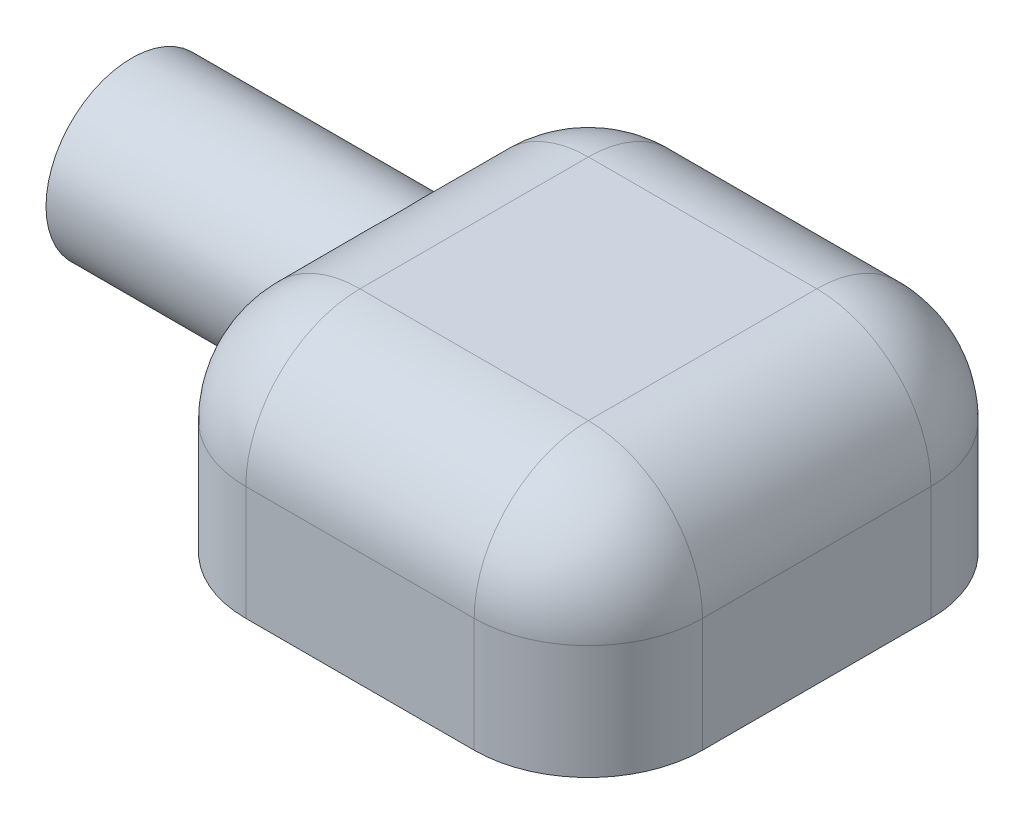
ISO-10303-21;
HEADER;
FILE_DESCRIPTION(('STEP AP214'),'2;1');
FILE_NAME('part.step','',(''),(''),'','','');
FILE_SCHEMA(('AUTOMOTIVE_DESIGN { 1 0 10303 214 1 1 1 1 }'));
ENDSEC;
DATA;
#1=APPLICATION_CONTEXT('core data for automotive mechanical design processes');
#2=APPLICATION_PROTOCOL_DEFINITION('international standard','automotive_design',2000,#1);
#3=PRODUCT_CONTEXT('',#1,'mechanical');
#4=PRODUCT('Part','Part','',(#3));
#5=PRODUCT_RELATED_PRODUCT_CATEGORY('part','',(#4));
#6=PRODUCT_DEFINITION_FORMATION('','',#4);
#7=PRODUCT_DEFINITION_CONTEXT('part definition',#1,'design');
#8=PRODUCT_DEFINITION('design','',#6,#7);
#9=PRODUCT_DEFINITION_SHAPE('','',#8);
#10=(LENGTH_UNIT() NAMED_UNIT(*) SI_UNIT(.MILLI.,.METRE.));
#11=(NAMED_UNIT(*) PLANE_ANGLE_UNIT() SI_UNIT($,.RADIAN.));
#12=(NAMED_UNIT(*) SI_UNIT($,.STERADIAN.) SOLID_ANGLE_UNIT());
#13=UNCERTAINTY_MEASURE_WITH_UNIT(LENGTH_MEASURE(1.E-05),#10,'distance_accuracy_value','');
#14=(GEOMETRIC_REPRESENTATION_CONTEXT(3) GLOBAL_UNCERTAINTY_ASSIGNED_CONTEXT((#13)) GLOBAL_UNIT_ASSIGNED_CONTEXT((#10,
#11,#12)) REPRESENTATION_CONTEXT('',''));
#15=CARTESIAN_POINT('',(0.,0.,0.));
#16=DIRECTION('',(0.,0.,1.));
#17=DIRECTION('',(1.,0.,0.));
#18=AXIS2_PLACEMENT_3D('',#15,#16,#17);
#19=CARTESIAN_POINT('',(-20.,20.,20.));
#20=DIRECTION('',(1.,0.,0.));
#21=DIRECTION('',(0.,0.,-1.));
#22=AXIS2_PLACEMENT_3D('',#19,#20,#21);
#23=PLANE('',#22);
#24=CARTESIAN_POINT('',(-20.,10.,0.));
#25=DIRECTION('',(-1.,0.,0.));
#26=DIRECTION('',(0.,0.,1.));
#27=AXIS2_PLACEMENT_3D('',#24,#25,#26);
#28=CIRCLE('',#27,7.5);
#29=CARTESIAN_POINT('',(-20.,10.,-7.5));
#30=VERTEX_POINT('',#29);
#31=CARTESIAN_POINT('',(-20.,10.,7.5));
#32=VERTEX_POINT('',#31);
#33=EDGE_CURVE('E163',#30,#32,#28,.T.);
#34=ORIENTED_EDGE('',*,*,#33,.F.);
#35=DIRECTION('',(0.,0.,1.));
#36=VECTOR('',#35,1.);
#37=CARTESIAN_POINT('',(-20.,10.,-20.));
#38=LINE('',#37,#36);
#39=CARTESIAN_POINT('',(-20.,10.,-10.));
#40=VERTEX_POINT('',#39);
#41=EDGE_CURVE('E57',#30,#40,#38,.F.);
#42=ORIENTED_EDGE('',*,*,#41,.T.);
#43=DIRECTION('',(0.,-1.,0.));
#44=VECTOR('',#43,1.);
#45=CARTESIAN_POINT('',(-20.,20.,-10.));
#46=LINE('',#45,#44);
#47=CARTESIAN_POINT('',(-20.,0.,-10.));
#48=VERTEX_POINT('',#47);
#49=EDGE_CURVE('E209',#40,#48,#46,.T.);
#50=ORIENTED_EDGE('',*,*,#49,.T.);
#51=DIRECTION('',(0.,0.,1.));
#52=VECTOR('',#51,1.);
#53=CARTESIAN_POINT('',(-20.,0.,20.));
#54=LINE('',#53,#52);
#55=CARTESIAN_POINT('',(-20.,0.,10.));
#56=VERTEX_POINT('',#55);
#57=EDGE_CURVE('E308',#48,#56,#54,.T.);
#58=ORIENTED_EDGE('',*,*,#57,.T.);
#59=DIRECTION('',(0.,-1.,0.));
#60=VECTOR('',#59,1.);
#61=CARTESIAN_POINT('',(-20.,20.,10.));
#62=LINE('',#61,#60);
#63=CARTESIAN_POINT('',(-20.,10.,10.));
#64=VERTEX_POINT('',#63);
#65=EDGE_CURVE('E64',#56,#64,#62,.F.);
#66=ORIENTED_EDGE('',*,*,#65,.T.);
#67=DIRECTION('',(0.,0.,1.));
#68=VECTOR('',#67,1.);
#69=CARTESIAN_POINT('',(-20.,10.,-20.));
#70=LINE('',#69,#68);
#71=EDGE_CURVE('E206',#64,#32,#70,.F.);
#72=ORIENTED_EDGE('',*,*,#71,.T.);
#73=EDGE_LOOP('',(#34,#42,#50,#58,#66,#72));
#74=FACE_BOUND('',#73,.T.);
#75=ADVANCED_FACE('F39',(#74),#23,.F.);
#76=CARTESIAN_POINT('',(20.,20.,20.));
#77=DIRECTION('',(0.,0.,-1.));
#78=DIRECTION('',(-1.,0.,0.));
#79=AXIS2_PLACEMENT_3D('',#76,#77,#78);
#80=PLANE('',#79);
#81=DIRECTION('',(1.,0.,0.));
#82=VECTOR('',#81,1.);
#83=CARTESIAN_POINT('',(20.,0.,20.));
#84=LINE('',#83,#82);
#85=CARTESIAN_POINT('',(-9.99999999999999,0.,20.));
#86=VERTEX_POINT('',#85);
#87=CARTESIAN_POINT('',(10.,0.,20.));
#88=VERTEX_POINT('',#87);
#89=EDGE_CURVE('E302',#86,#88,#84,.T.);
#90=ORIENTED_EDGE('',*,*,#89,.T.);
#91=DIRECTION('',(0.,-1.,0.));
#92=VECTOR('',#91,1.);
#93=CARTESIAN_POINT('',(10.,20.,20.));
#94=LINE('',#93,#92);
#95=CARTESIAN_POINT('',(10.,10.,20.));
#96=VERTEX_POINT('',#95);
#97=EDGE_CURVE('E184',#88,#96,#94,.F.);
#98=ORIENTED_EDGE('',*,*,#97,.T.);
#99=DIRECTION('',(1.,0.,0.));
#100=VECTOR('',#99,1.);
#101=CARTESIAN_POINT('',(-20.,10.,20.));
#102=LINE('',#101,#100);
#103=CARTESIAN_POINT('',(-9.99999999999999,10.,20.));
#104=VERTEX_POINT('',#103);
#105=EDGE_CURVE('E180',#96,#104,#102,.F.);
#106=ORIENTED_EDGE('',*,*,#105,.T.);
#107=DIRECTION('',(0.,-1.,0.));
#108=VECTOR('',#107,1.);
#109=CARTESIAN_POINT('',(-9.99999999999999,20.,20.));
#110=LINE('',#109,#108);
#111=EDGE_CURVE('E177',#104,#86,#110,.T.);
#112=ORIENTED_EDGE('',*,*,#111,.T.);
#113=EDGE_LOOP('',(#90,#98,#106,#112));
#114=FACE_BOUND('',#113,.T.);
#115=ADVANCED_FACE('F263',(#114),#80,.F.);
#116=CARTESIAN_POINT('',(20.,20.,20.));
#117=DIRECTION('',(-1.,0.,0.));
#118=DIRECTION('',(0.,0.,1.));
#119=AXIS2_PLACEMENT_3D('',#116,#117,#118);
#120=PLANE('',#119);
#121=DIRECTION('',(0.,0.,-1.));
#122=VECTOR('',#121,1.);
#123=CARTESIAN_POINT('',(20.,0.,20.));
#124=LINE('',#123,#122);
#125=CARTESIAN_POINT('',(20.,0.,10.));
#126=VERTEX_POINT('',#125);
#127=CARTESIAN_POINT('',(20.,0.,-10.));
#128=VERTEX_POINT('',#127);
#129=EDGE_CURVE('E305',#126,#128,#124,.T.);
#130=ORIENTED_EDGE('',*,*,#129,.T.);
#131=DIRECTION('',(0.,-1.,0.));
#132=VECTOR('',#131,1.);
#133=CARTESIAN_POINT('',(20.,20.,-10.));
#134=LINE('',#133,#132);
#135=CARTESIAN_POINT('',(20.,10.,-10.));
#136=VERTEX_POINT('',#135);
#137=EDGE_CURVE('E193',#128,#136,#134,.F.);
#138=ORIENTED_EDGE('',*,*,#137,.T.);
#139=DIRECTION('',(0.,0.,-1.));
#140=VECTOR('',#139,1.);
#141=CARTESIAN_POINT('',(20.,10.,20.));
#142=LINE('',#141,#140);
#143=CARTESIAN_POINT('',(20.,10.,10.));
#144=VERTEX_POINT('',#143);
#145=EDGE_CURVE('E190',#136,#144,#142,.F.);
#146=ORIENTED_EDGE('',*,*,#145,.T.);
#147=DIRECTION('',(0.,-1.,0.));
#148=VECTOR('',#147,1.);
#149=CARTESIAN_POINT('',(20.,20.,10.));
#150=LINE('',#149,#148);
#151=EDGE_CURVE('E187',#144,#126,#150,.T.);
#152=ORIENTED_EDGE('',*,*,#151,.T.);
#153=EDGE_LOOP('',(#130,#138,#146,#152));
#154=FACE_BOUND('',#153,.T.);
#155=ADVANCED_FACE('F268',(#154),#120,.F.);
#156=CARTESIAN_POINT('',(20.,20.,-20.));
#157=DIRECTION('',(0.,0.,1.));
#158=DIRECTION('',(1.,0.,0.));
#159=AXIS2_PLACEMENT_3D('',#156,#157,#158);
#160=PLANE('',#159);
#161=DIRECTION('',(-1.,0.,0.));
#162=VECTOR('',#161,1.);
#163=CARTESIAN_POINT('',(20.,0.,-20.));
#164=LINE('',#163,#162);
#165=CARTESIAN_POINT('',(10.,0.,-20.));
#166=VERTEX_POINT('',#165);
#167=CARTESIAN_POINT('',(-9.99999999999999,0.,-20.));
#168=VERTEX_POINT('',#167);
#169=EDGE_CURVE('E167',#166,#168,#164,.T.);
#170=ORIENTED_EDGE('',*,*,#169,.T.);
#171=DIRECTION('',(0.,-1.,0.));
#172=VECTOR('',#171,1.);
#173=CARTESIAN_POINT('',(-9.99999999999999,20.,-20.));
#174=LINE('',#173,#172);
#175=CARTESIAN_POINT('',(-10.,10.,-20.));
#176=VERTEX_POINT('',#175);
#177=EDGE_CURVE('E201',#168,#176,#174,.F.);
#178=ORIENTED_EDGE('',*,*,#177,.T.);
#179=DIRECTION('',(-1.,0.,0.));
#180=VECTOR('',#179,1.);
#181=CARTESIAN_POINT('',(20.,10.,-20.));
#182=LINE('',#181,#180);
#183=CARTESIAN_POINT('',(10.,10.,-20.));
#184=VERTEX_POINT('',#183);
#185=EDGE_CURVE('E143',#176,#184,#182,.F.);
#186=ORIENTED_EDGE('',*,*,#185,.T.);
#187=DIRECTION('',(0.,-1.,0.));
#188=VECTOR('',#187,1.);
#189=CARTESIAN_POINT('',(10.,20.,-20.));
#190=LINE('',#189,#188);
#191=EDGE_CURVE('E196',#184,#166,#190,.T.);
#192=ORIENTED_EDGE('',*,*,#191,.T.);
#193=EDGE_LOOP('',(#170,#178,#186,#192));
#194=FACE_BOUND('',#193,.T.);
#195=ADVANCED_FACE('F365',(#194),#160,.F.);
#196=CARTESIAN_POINT('',(0.,20.,0.));
#197=DIRECTION('',(0.,1.,0.));
#198=DIRECTION('',(0.,0.,1.));
#199=AXIS2_PLACEMENT_3D('',#196,#197,#198);
#200=PLANE('',#199);
#201=DIRECTION('',(0.,0.,1.));
#202=VECTOR('',#201,1.);
#203=CARTESIAN_POINT('',(-10.,20.,20.));
#204=LINE('',#203,#202);
#205=CARTESIAN_POINT('',(-10.,20.,-10.));
#206=VERTEX_POINT('',#205);
#207=CARTESIAN_POINT('',(-10.,20.,10.));
#208=VERTEX_POINT('',#207);
#209=EDGE_CURVE('E129',#206,#208,#204,.T.);
#210=ORIENTED_EDGE('',*,*,#209,.T.);
#211=DIRECTION('',(1.,0.,0.));
#212=VECTOR('',#211,1.);
#213=CARTESIAN_POINT('',(20.,20.,10.));
#214=LINE('',#213,#212);
#215=CARTESIAN_POINT('',(10.,20.,10.));
#216=VERTEX_POINT('',#215);
#217=EDGE_CURVE('E174',#208,#216,#214,.T.);
#218=ORIENTED_EDGE('',*,*,#217,.T.);
#219=DIRECTION('',(0.,0.,-1.));
#220=VECTOR('',#219,1.);
#221=CARTESIAN_POINT('',(10.,20.,-20.));
#222=LINE('',#221,#220);
#223=CARTESIAN_POINT('',(10.,20.,-10.));
#224=VERTEX_POINT('',#223);
#225=EDGE_CURVE('E132',#216,#224,#222,.T.);
#226=ORIENTED_EDGE('',*,*,#225,.T.);
#227=DIRECTION('',(-1.,0.,0.));
#228=VECTOR('',#227,1.);
#229=CARTESIAN_POINT('',(-20.,20.,-10.));
#230=LINE('',#229,#228);
#231=EDGE_CURVE('E124',#224,#206,#230,.T.);
#232=ORIENTED_EDGE('',*,*,#231,.T.);
#233=EDGE_LOOP('',(#210,#218,#226,#232));
#234=FACE_BOUND('',#233,.T.);
#235=ADVANCED_FACE('F126',(#234),#200,.T.);
#236=CARTESIAN_POINT('',(0.,0.,0.));
#237=DIRECTION('',(0.,1.,0.));
#238=DIRECTION('',(0.,0.,1.));
#239=AXIS2_PLACEMENT_3D('',#236,#237,#238);
#240=PLANE('',#239);
#241=CARTESIAN_POINT('',(0.,0.,0.));
#242=DIRECTION('',(0.,-1.,0.));
#243=DIRECTION('',(0.,0.,-1.));
#244=AXIS2_PLACEMENT_3D('',#241,#242,#243);
#245=CIRCLE('',#244,5.);
#246=CARTESIAN_POINT('',(0.,0.,-5.));
#247=VERTEX_POINT('',#246);
#248=EDGE_CURVE('E315',#247,#247,#245,.T.);
#249=ORIENTED_EDGE('',*,*,#248,.F.);
#250=EDGE_LOOP('',(#249));
#251=FACE_BOUND('',#250,.T.);
#252=ORIENTED_EDGE('',*,*,#57,.F.);
#253=CARTESIAN_POINT('',(-10.,0.,-10.));
#254=DIRECTION('',(0.,1.,0.));
#255=DIRECTION('',(0.,0.,1.));
#256=AXIS2_PLACEMENT_3D('',#253,#254,#255);
#257=CIRCLE('',#256,10.);
#258=EDGE_CURVE('E49',#48,#168,#257,.F.);
#259=ORIENTED_EDGE('',*,*,#258,.T.);
#260=ORIENTED_EDGE('',*,*,#169,.F.);
#261=CARTESIAN_POINT('',(10.,0.,-10.));
#262=DIRECTION('',(0.,1.,0.));
#263=DIRECTION('',(0.,0.,1.));
#264=AXIS2_PLACEMENT_3D('',#261,#262,#263);
#265=CIRCLE('',#264,10.);
#266=EDGE_CURVE('E220',#166,#128,#265,.F.);
#267=ORIENTED_EDGE('',*,*,#266,.T.);
#268=ORIENTED_EDGE('',*,*,#129,.F.);
#269=CARTESIAN_POINT('',(10.,0.,10.));
#270=DIRECTION('',(0.,1.,0.));
#271=DIRECTION('',(0.,0.,1.));
#272=AXIS2_PLACEMENT_3D('',#269,#270,#271);
#273=CIRCLE('',#272,10.);
#274=EDGE_CURVE('E217',#126,#88,#273,.F.);
#275=ORIENTED_EDGE('',*,*,#274,.T.);
#276=ORIENTED_EDGE('',*,*,#89,.F.);
#277=CARTESIAN_POINT('',(-9.99999999999999,0.,10.));
#278=DIRECTION('',(0.,1.,0.));
#279=DIRECTION('',(0.,0.,1.));
#280=AXIS2_PLACEMENT_3D('',#277,#278,#279);
#281=CIRCLE('',#280,10.);
#282=EDGE_CURVE('E214',#86,#56,#281,.F.);
#283=ORIENTED_EDGE('',*,*,#282,.T.);
#284=EDGE_LOOP('',(#252,#259,#260,#267,#268,#275,#276,#283));
#285=FACE_BOUND('',#284,.T.);
#286=ADVANCED_FACE('F301',(#251,#285),#240,.F.);
#287=CARTESIAN_POINT('',(0.,10.,0.));
#288=DIRECTION('',(0.,-1.,0.));
#289=DIRECTION('',(0.,0.,-1.));
#290=AXIS2_PLACEMENT_3D('',#287,#288,#289);
#291=CYLINDRICAL_SURFACE('',#290,5.);
#292=CARTESIAN_POINT('',(0.,10.,0.));
#293=DIRECTION('',(0.,-1.,0.));
#294=DIRECTION('',(0.,0.,-1.));
#295=AXIS2_PLACEMENT_3D('',#292,#293,#294);
#296=CIRCLE('',#295,5.);
#297=CARTESIAN_POINT('',(0.,10.,-5.));
#298=VERTEX_POINT('',#297);
#299=EDGE_CURVE('E312',#298,#298,#296,.T.);
#300=ORIENTED_EDGE('',*,*,#299,.F.);
#301=EDGE_LOOP('',(#300));
#302=FACE_BOUND('',#301,.T.);
#303=ORIENTED_EDGE('',*,*,#248,.T.);
#304=EDGE_LOOP('',(#303));
#305=FACE_BOUND('',#304,.T.);
#306=ADVANCED_FACE('F379',(#302,#305),#291,.F.);
#307=CARTESIAN_POINT('',(0.,10.,0.));
#308=DIRECTION('',(0.,-1.,0.));
#309=DIRECTION('',(0.,0.,-1.));
#310=AXIS2_PLACEMENT_3D('',#307,#308,#309);
#311=PLANE('',#310);
#312=ORIENTED_EDGE('',*,*,#299,.T.);
#313=EDGE_LOOP('',(#312));
#314=FACE_BOUND('',#313,.T.);
#315=ADVANCED_FACE('F384',(#314),#311,.T.);
#316=CARTESIAN_POINT('',(-40.,10.,0.));
#317=DIRECTION('',(1.,0.,0.));
#318=DIRECTION('',(0.,0.,-1.));
#319=AXIS2_PLACEMENT_3D('',#316,#317,#318);
#320=CYLINDRICAL_SURFACE('',#319,7.5);
#321=CARTESIAN_POINT('',(-40.,10.,0.));
#322=DIRECTION('',(-1.,0.,0.));
#323=DIRECTION('',(0.,0.,1.));
#324=AXIS2_PLACEMENT_3D('',#321,#322,#323);
#325=CIRCLE('',#324,7.5);
#326=CARTESIAN_POINT('',(-40.,10.,7.5));
#327=VERTEX_POINT('',#326);
#328=EDGE_CURVE('E319',#327,#327,#325,.T.);
#329=ORIENTED_EDGE('',*,*,#328,.F.);
#330=EDGE_LOOP('',(#329));
#331=FACE_BOUND('',#330,.T.);
#332=ORIENTED_EDGE('',*,*,#33,.T.);
#333=CARTESIAN_POINT('',(-20.,10.,7.5));
#334=CARTESIAN_POINT('',(-20.0000431104682,10.1841738744631,7.50004050321944));
#335=CARTESIAN_POINT('',(-19.9949137933506,10.3683219259622,7.49321787631811));
#336=CARTESIAN_POINT('',(-19.9746322944943,10.7349592518763,7.46615279451846));
#337=CARTESIAN_POINT('',(-19.9594865115322,10.9174495099331,7.44591890706099));
#338=CARTESIAN_POINT('',(-19.9196285842821,11.2781787860852,7.39251824996346));
#339=CARTESIAN_POINT('',(-19.8949818446439,11.456438211211,7.35943989061012));
#340=CARTESIAN_POINT('',(-19.8366891942072,11.8087046669283,7.28087574757302));
#341=CARTESIAN_POINT('',(-19.8030422965333,11.9827112289046,7.23538860324386));
#342=CARTESIAN_POINT('',(-19.7275566853336,12.3249219518872,7.13278095988876));
#343=CARTESIAN_POINT('',(-19.6857390753953,12.4931397749925,7.07569041555169));
#344=CARTESIAN_POINT('',(-19.5946789503449,12.8233892421049,6.95051788317897));
#345=CARTESIAN_POINT('',(-19.5454334895583,12.9854183997722,6.88243153375904));
#346=CARTESIAN_POINT('',(-19.3877730974116,13.4613983089517,6.66264144761604));
#347=CARTESIAN_POINT('',(-19.2694680316575,13.7650932406762,6.49545195104048));
#348=CARTESIAN_POINT('',(-19.0024538167944,14.3674188239573,6.10864605094154));
#349=CARTESIAN_POINT('',(-18.851950616732,14.6630256757502,5.88562595031234));
#350=CARTESIAN_POINT('',(-18.5382897629343,15.2152099623529,5.40244124260132));
#351=CARTESIAN_POINT('',(-18.3751157087064,15.471735496907,5.14222811608287));
#352=CARTESIAN_POINT('',(-18.11230553927,15.8498322868317,4.69866085026372));
#353=CARTESIAN_POINT('',(-18.0132228243878,15.9844868547981,4.52592400461853));
#354=CARTESIAN_POINT('',(-17.8169225501917,16.2387082025361,4.16852839903836));
#355=CARTESIAN_POINT('',(-17.7197055612519,16.3582704287992,3.98386606634736));
#356=CARTESIAN_POINT('',(-17.530244611729,16.5815525892536,3.60302923743356));
#357=CARTESIAN_POINT('',(-17.4379957444358,16.685288347074,3.4068665148809));
#358=CARTESIAN_POINT('',(-17.2619499836615,16.8761125986537,3.00315722477742));
#359=CARTESIAN_POINT('',(-17.1781482905307,16.9632105714057,2.79561722643469));
#360=CARTESIAN_POINT('',(-16.9988600344767,17.1440083098094,2.30254773832761));
#361=CARTESIAN_POINT('',(-16.9078738284527,17.2313029582894,2.01287364916542));
#362=CARTESIAN_POINT('',(-16.7958278418222,17.3361667462076,1.56653373641359));
#363=CARTESIAN_POINT('',(-16.7625632191023,17.3667651143917,1.41587010436073));
#364=CARTESIAN_POINT('',(-16.7054111919796,17.4188246702935,1.1112497493723));
#365=CARTESIAN_POINT('',(-16.6815189556027,17.4402905667803,0.957294766593801));
#366=CARTESIAN_POINT('',(-16.6439948814974,17.4738195703279,0.645615393988582));
#367=CARTESIAN_POINT('',(-16.6304622538383,17.4857917981603,0.487869122565862));
#368=CARTESIAN_POINT('',(-16.6147101457692,17.4997148044991,0.171366694033752));
#369=CARTESIAN_POINT('',(-16.6124903549221,17.5016658579979,0.0126105647556987));
#370=CARTESIAN_POINT('',(-16.6194861928762,17.49549376108,-0.304506706637779));
#371=CARTESIAN_POINT('',(-16.6287055740905,17.4873673049191,-0.462867702058576));
#372=CARTESIAN_POINT('',(-16.6580933170681,17.4612438430627,-0.777706659833864));
#373=CARTESIAN_POINT('',(-16.6782617904185,17.4432467367709,-0.934184602980699));
#374=CARTESIAN_POINT('',(-16.7484102609705,17.3798860355031,-1.36575156826947));
#375=CARTESIAN_POINT('',(-16.8093652127514,17.3241294293293,-1.6376092681829));
#376=CARTESIAN_POINT('',(-16.9557042710842,17.1852765476938,-2.16727426939731));
#377=CARTESIAN_POINT('',(-17.0411115168492,17.1021543649567,-2.42506798553943));
#378=CARTESIAN_POINT('',(-17.2109904166375,16.9291749655751,-2.87816648865653));
#379=CARTESIAN_POINT('',(-17.2926611077226,16.843470860649,-3.07615359093676));
#380=CARTESIAN_POINT('',(-17.4634165372545,16.6568318226309,-3.46156982641272));
#381=CARTESIAN_POINT('',(-17.5525050689389,16.5558890752844,-3.64899347464078));
#382=CARTESIAN_POINT('',(-17.7351714741661,16.3393405092557,-4.01345092424072));
#383=CARTESIAN_POINT('',(-17.8287584051296,16.2237042647876,-4.19046201877399));
#384=CARTESIAN_POINT('',(-18.0176128439829,15.978447932338,-4.5334981921366));
#385=CARTESIAN_POINT('',(-18.1128800848597,15.8488300496851,-4.69952499687611));
#386=CARTESIAN_POINT('',(-18.3052079825125,15.5724834421015,-5.02434388761625));
#387=CARTESIAN_POINT('',(-18.4022534375536,15.4254061981582,-5.18284875808462));
#388=CARTESIAN_POINT('',(-18.5934779383871,15.1171321583938,-5.48743169744924));
#389=CARTESIAN_POINT('',(-18.6876566824554,14.9559338831968,-5.63350846115954));
#390=CARTESIAN_POINT('',(-18.8708645951805,14.6199906476629,-5.91212575715525));
#391=CARTESIAN_POINT('',(-18.9599015494407,14.445267158807,-6.04468700052519));
#392=CARTESIAN_POINT('',(-19.1308952209463,14.0825152156026,-6.29536679958986));
#393=CARTESIAN_POINT('',(-19.2128538512084,13.8944903812779,-6.41348926117587));
#394=CARTESIAN_POINT('',(-19.3521626385218,13.5447236904022,-6.61187399722417));
#395=CARTESIAN_POINT('',(-19.4111561854588,13.3852459895458,-6.69498345710786));
#396=CARTESIAN_POINT('',(-19.522269197005,13.0587747501575,-6.85029604213204));
#397=CARTESIAN_POINT('',(-19.5743901145844,12.8917828102863,-6.9225014730075));
#398=CARTESIAN_POINT('',(-19.6706867816775,12.5512875862025,-7.05508718709219));
#399=CARTESIAN_POINT('',(-19.7148758315408,12.3777958030351,-7.11548728118843));
#400=CARTESIAN_POINT('',(-19.7944894774144,12.0250061742528,-7.22380610298345));
#401=CARTESIAN_POINT('',(-19.8299159056274,11.845709551271,-7.27172744001361));
#402=CARTESIAN_POINT('',(-19.8833392235779,11.5291677960773,-7.34376026982323));
#403=CARTESIAN_POINT('',(-19.9034758036527,11.3929461693576,-7.3708259243877));
#404=CARTESIAN_POINT('',(-19.9382084156022,11.118540909062,-7.41742727390435));
#405=CARTESIAN_POINT('',(-19.9528056048828,10.9803576916095,-7.43696454185859));
#406=CARTESIAN_POINT('',(-19.9762945559199,10.7021900338182,-7.46837118933213));
#407=CARTESIAN_POINT('',(-19.9851679650993,10.5622012531547,-7.48021590447394));
#408=CARTESIAN_POINT('',(-19.9970292580462,10.2814777144256,-7.49603882915343));
#409=CARTESIAN_POINT('',(-20.0000148434033,10.1407426865369,-7.50001396667261));
#410=CARTESIAN_POINT('',(-20.,10.,-7.5));
#411=B_SPLINE_CURVE_WITH_KNOTS('',3,(#333,#334,#335,#336,#337,#338,#339,#340,#341,#342,#343,
#344,#345,#346,#347,#348,#349,#350,#351,#352,#353,#354,#355,#356,#357,#358,#359,#360,#361,#362,
#363,#364,#365,#366,#367,#368,#369,#370,#371,#372,#373,#374,#375,#376,#377,#378,#379,#380,#381,
#382,#383,#384,#385,#386,#387,#388,#389,#390,#391,#392,#393,#394,#395,#396,#397,#398,#399,#400,
#401,#402,#403,#404,#405,#406,#407,#408,#409,#410),.UNSPECIFIED.,.F.,.F.,(4,2,2,2,2,2,2,2,2,2,2,
2,2,2,2,2,2,2,2,2,2,2,2,2,2,2,2,2,2,2,2,2,2,2,2,2,2,2,4),(0.,0.552283190814487,1.10421390924166,
1.65241109509657,2.20066841592936,2.74752796456997,3.2946049551318,4.38922973516188,
5.58433366881164,6.78101112763898,7.50151780672138,8.22224135282451,8.94223951452471,
9.66182624246,10.6057191345898,11.0771371309276,11.548311765253,12.0239440873989,
12.4995633575875,12.9753386873247,13.4511188659961,14.3000694308117,15.1498260282635,
15.840971314364,16.5324722257575,17.2254291011417,17.9182768355854,18.6285606539084,
19.3389189736094,20.048171846518,20.7572324300522,21.3244844058571,21.8916162637056,
22.4577880715925,23.0238413966595,23.4445504418576,23.8651715352102,24.287134679748,
24.7092625120558),.UNSPECIFIED.);
#412=EDGE_CURVE('E11',#32,#30,#411,.T.);
#413=ORIENTED_EDGE('',*,*,#412,.T.);
#414=EDGE_LOOP('',(#332,#413));
#415=FACE_BOUND('',#414,.T.);
#416=ADVANCED_FACE('F233',(#331,#415),#320,.T.);
#417=CARTESIAN_POINT('',(-40.,10.,0.));
#418=DIRECTION('',(-1.,0.,0.));
#419=DIRECTION('',(0.,0.,1.));
#420=AXIS2_PLACEMENT_3D('',#417,#418,#419);
#421=PLANE('',#420);
#422=ORIENTED_EDGE('',*,*,#328,.T.);
#423=EDGE_LOOP('',(#422));
#424=FACE_BOUND('',#423,.T.);
#425=ADVANCED_FACE('F260',(#424),#421,.T.);
#426=CARTESIAN_POINT('',(-10.,20.,-10.));
#427=DIRECTION('',(0.,-1.,0.));
#428=DIRECTION('',(0.,0.,-1.));
#429=AXIS2_PLACEMENT_3D('',#426,#427,#428);
#430=CYLINDRICAL_SURFACE('',#429,10.);
#431=ORIENTED_EDGE('',*,*,#258,.F.);
#432=ORIENTED_EDGE('',*,*,#49,.F.);
#433=CARTESIAN_POINT('',(-9.99999999999999,10.,-10.));
#434=DIRECTION('',(0.,1.,0.));
#435=DIRECTION('',(0.,0.,1.));
#436=AXIS2_PLACEMENT_3D('',#433,#434,#435);
#437=CIRCLE('',#436,10.);
#438=EDGE_CURVE('E43',#176,#40,#437,.T.);
#439=ORIENTED_EDGE('',*,*,#438,.F.);
#440=ORIENTED_EDGE('',*,*,#177,.F.);
#441=EDGE_LOOP('',(#431,#432,#439,#440));
#442=FACE_BOUND('',#441,.T.);
#443=ADVANCED_FACE('F41',(#442),#430,.T.);
#444=CARTESIAN_POINT('',(0.,10.,-10.));
#445=DIRECTION('',(1.,0.,0.));
#446=DIRECTION('',(0.,0.,-1.));
#447=AXIS2_PLACEMENT_3D('',#444,#445,#446);
#448=CYLINDRICAL_SURFACE('',#447,10.);
#449=CARTESIAN_POINT('',(10.,10.,-10.));
#450=DIRECTION('',(1.,0.,0.));
#451=DIRECTION('',(0.,1.,0.));
#452=AXIS2_PLACEMENT_3D('',#449,#450,#451);
#453=CIRCLE('',#452,10.);
#454=EDGE_CURVE('E148',#184,#224,#453,.T.);
#455=ORIENTED_EDGE('',*,*,#454,.F.);
#456=ORIENTED_EDGE('',*,*,#185,.F.);
#457=CARTESIAN_POINT('',(-10.,10.,-10.));
#458=DIRECTION('',(-1.,0.,0.));
#459=DIRECTION('',(0.,0.,1.));
#460=AXIS2_PLACEMENT_3D('',#457,#458,#459);
#461=CIRCLE('',#460,10.);
#462=EDGE_CURVE('E140',#206,#176,#461,.T.);
#463=ORIENTED_EDGE('',*,*,#462,.F.);
#464=ORIENTED_EDGE('',*,*,#231,.F.);
#465=EDGE_LOOP('',(#455,#456,#463,#464));
#466=FACE_BOUND('',#465,.T.);
#467=ADVANCED_FACE('F142',(#466),#448,.T.);
#468=CARTESIAN_POINT('',(10.,20.,-10.));
#469=DIRECTION('',(0.,-1.,0.));
#470=DIRECTION('',(0.,0.,-1.));
#471=AXIS2_PLACEMENT_3D('',#468,#469,#470);
#472=CYLINDRICAL_SURFACE('',#471,10.);
#473=ORIENTED_EDGE('',*,*,#266,.F.);
#474=ORIENTED_EDGE('',*,*,#191,.F.);
#475=CARTESIAN_POINT('',(10.,10.,-10.));
#476=DIRECTION('',(0.,1.,0.));
#477=DIRECTION('',(0.,0.,1.));
#478=AXIS2_PLACEMENT_3D('',#475,#476,#477);
#479=CIRCLE('',#478,10.);
#480=EDGE_CURVE('E154',#136,#184,#479,.T.);
#481=ORIENTED_EDGE('',*,*,#480,.F.);
#482=ORIENTED_EDGE('',*,*,#137,.F.);
#483=EDGE_LOOP('',(#473,#474,#481,#482));
#484=FACE_BOUND('',#483,.T.);
#485=ADVANCED_FACE('F253',(#484),#472,.T.);
#486=CARTESIAN_POINT('',(-10.,10.,-10.));
#487=DIRECTION('',(0.,0.,1.));
#488=DIRECTION('',(1.,0.,0.));
#489=AXIS2_PLACEMENT_3D('',#486,#487,#488);
#490=SPHERICAL_SURFACE('',#489,10.);
#491=ORIENTED_EDGE('',*,*,#462,.T.);
#492=ORIENTED_EDGE('',*,*,#438,.T.);
#493=CARTESIAN_POINT('',(-10.,10.,-10.));
#494=DIRECTION('',(0.,0.,-1.));
#495=DIRECTION('',(-1.,0.,0.));
#496=AXIS2_PLACEMENT_3D('',#493,#494,#495);
#497=CIRCLE('',#496,10.);
#498=EDGE_CURVE('E150',#206,#40,#497,.F.);
#499=ORIENTED_EDGE('',*,*,#498,.F.);
#500=EDGE_LOOP('',(#491,#492,#499));
#501=FACE_BOUND('',#500,.T.);
#502=ADVANCED_FACE('F151',(#501),#490,.T.);
#503=CARTESIAN_POINT('',(10.,10.,-10.));
#504=DIRECTION('',(0.,0.,1.));
#505=DIRECTION('',(1.,0.,0.));
#506=AXIS2_PLACEMENT_3D('',#503,#504,#505);
#507=SPHERICAL_SURFACE('',#506,10.);
#508=ORIENTED_EDGE('',*,*,#480,.T.);
#509=ORIENTED_EDGE('',*,*,#454,.T.);
#510=CARTESIAN_POINT('',(10.,10.,-10.));
#511=DIRECTION('',(0.,0.,-1.));
#512=DIRECTION('',(-1.,0.,0.));
#513=AXIS2_PLACEMENT_3D('',#510,#511,#512);
#514=CIRCLE('',#513,10.);
#515=EDGE_CURVE('E155',#136,#224,#514,.F.);
#516=ORIENTED_EDGE('',*,*,#515,.F.);
#517=EDGE_LOOP('',(#508,#509,#516));
#518=FACE_BOUND('',#517,.T.);
#519=ADVANCED_FACE('F246',(#518),#507,.T.);
#520=CARTESIAN_POINT('',(-9.99999999999999,20.,10.));
#521=DIRECTION('',(0.,-1.,0.));
#522=DIRECTION('',(0.,0.,-1.));
#523=AXIS2_PLACEMENT_3D('',#520,#521,#522);
#524=CYLINDRICAL_SURFACE('',#523,10.);
#525=ORIENTED_EDGE('',*,*,#282,.F.);
#526=ORIENTED_EDGE('',*,*,#111,.F.);
#527=CARTESIAN_POINT('',(-10.,10.,10.));
#528=DIRECTION('',(0.,1.,0.));
#529=DIRECTION('',(0.,0.,1.));
#530=AXIS2_PLACEMENT_3D('',#527,#528,#529);
#531=CIRCLE('',#530,10.);
#532=EDGE_CURVE('E336',#64,#104,#531,.T.);
#533=ORIENTED_EDGE('',*,*,#532,.F.);
#534=ORIENTED_EDGE('',*,*,#65,.F.);
#535=EDGE_LOOP('',(#525,#526,#533,#534));
#536=FACE_BOUND('',#535,.T.);
#537=ADVANCED_FACE('F242',(#536),#524,.T.);
#538=CARTESIAN_POINT('',(-10.,10.,0.));
#539=DIRECTION('',(0.,0.,-1.));
#540=DIRECTION('',(-1.,0.,0.));
#541=AXIS2_PLACEMENT_3D('',#538,#539,#540);
#542=CYLINDRICAL_SURFACE('',#541,10.);
#543=ORIENTED_EDGE('',*,*,#412,.F.);
#544=ORIENTED_EDGE('',*,*,#71,.F.);
#545=CARTESIAN_POINT('',(-10.,10.,10.));
#546=DIRECTION('',(0.,0.,1.));
#547=DIRECTION('',(1.,0.,0.));
#548=AXIS2_PLACEMENT_3D('',#545,#546,#547);
#549=CIRCLE('',#548,10.);
#550=EDGE_CURVE('E160',#208,#64,#549,.T.);
#551=ORIENTED_EDGE('',*,*,#550,.F.);
#552=ORIENTED_EDGE('',*,*,#209,.F.);
#553=ORIENTED_EDGE('',*,*,#498,.T.);
#554=ORIENTED_EDGE('',*,*,#41,.F.);
#555=EDGE_LOOP('',(#543,#544,#551,#552,#553,#554));
#556=FACE_BOUND('',#555,.T.);
#557=ADVANCED_FACE('F158',(#556),#542,.T.);
#558=CARTESIAN_POINT('',(10.,10.,0.));
#559=DIRECTION('',(0.,0.,1.));
#560=DIRECTION('',(1.,0.,0.));
#561=AXIS2_PLACEMENT_3D('',#558,#559,#560);
#562=CYLINDRICAL_SURFACE('',#561,10.);
#563=ORIENTED_EDGE('',*,*,#515,.T.);
#564=ORIENTED_EDGE('',*,*,#225,.F.);
#565=CARTESIAN_POINT('',(10.,10.,10.));
#566=DIRECTION('',(0.,0.,1.));
#567=DIRECTION('',(1.,0.,0.));
#568=AXIS2_PLACEMENT_3D('',#565,#566,#567);
#569=CIRCLE('',#568,10.);
#570=EDGE_CURVE('E342',#144,#216,#569,.T.);
#571=ORIENTED_EDGE('',*,*,#570,.F.);
#572=ORIENTED_EDGE('',*,*,#145,.F.);
#573=EDGE_LOOP('',(#563,#564,#571,#572));
#574=FACE_BOUND('',#573,.T.);
#575=ADVANCED_FACE('F241',(#574),#562,.T.);
#576=CARTESIAN_POINT('',(10.,20.,10.));
#577=DIRECTION('',(0.,-1.,0.));
#578=DIRECTION('',(0.,0.,-1.));
#579=AXIS2_PLACEMENT_3D('',#576,#577,#578);
#580=CYLINDRICAL_SURFACE('',#579,10.);
#581=ORIENTED_EDGE('',*,*,#274,.F.);
#582=ORIENTED_EDGE('',*,*,#151,.F.);
#583=CARTESIAN_POINT('',(10.,10.,10.));
#584=DIRECTION('',(0.,1.,0.));
#585=DIRECTION('',(0.,0.,1.));
#586=AXIS2_PLACEMENT_3D('',#583,#584,#585);
#587=CIRCLE('',#586,10.);
#588=EDGE_CURVE('E346',#96,#144,#587,.T.);
#589=ORIENTED_EDGE('',*,*,#588,.F.);
#590=ORIENTED_EDGE('',*,*,#97,.F.);
#591=EDGE_LOOP('',(#581,#582,#589,#590));
#592=FACE_BOUND('',#591,.T.);
#593=ADVANCED_FACE('F283',(#592),#580,.T.);
#594=CARTESIAN_POINT('',(-10.,10.,10.));
#595=DIRECTION('',(0.,0.,1.));
#596=DIRECTION('',(1.,0.,0.));
#597=AXIS2_PLACEMENT_3D('',#594,#595,#596);
#598=SPHERICAL_SURFACE('',#597,10.);
#599=ORIENTED_EDGE('',*,*,#550,.T.);
#600=ORIENTED_EDGE('',*,*,#532,.T.);
#601=CARTESIAN_POINT('',(-9.99999999999999,10.,10.));
#602=DIRECTION('',(-1.,0.,0.));
#603=DIRECTION('',(0.,0.,1.));
#604=AXIS2_PLACEMENT_3D('',#601,#602,#603);
#605=CIRCLE('',#604,10.);
#606=EDGE_CURVE('E350',#208,#104,#605,.F.);
#607=ORIENTED_EDGE('',*,*,#606,.F.);
#608=EDGE_LOOP('',(#599,#600,#607));
#609=FACE_BOUND('',#608,.T.);
#610=ADVANCED_FACE('F280',(#609),#598,.T.);
#611=CARTESIAN_POINT('',(10.,10.,10.));
#612=DIRECTION('',(0.,0.,1.));
#613=DIRECTION('',(1.,0.,0.));
#614=AXIS2_PLACEMENT_3D('',#611,#612,#613);
#615=SPHERICAL_SURFACE('',#614,10.);
#616=ORIENTED_EDGE('',*,*,#588,.T.);
#617=ORIENTED_EDGE('',*,*,#570,.T.);
#618=CARTESIAN_POINT('',(10.,10.,10.));
#619=DIRECTION('',(1.,0.,0.));
#620=DIRECTION('',(0.,0.,-1.));
#621=AXIS2_PLACEMENT_3D('',#618,#619,#620);
#622=CIRCLE('',#621,10.);
#623=EDGE_CURVE('E231',#96,#216,#622,.F.);
#624=ORIENTED_EDGE('',*,*,#623,.F.);
#625=EDGE_LOOP('',(#616,#617,#624));
#626=FACE_BOUND('',#625,.T.);
#627=ADVANCED_FACE('F276',(#626),#615,.T.);
#628=CARTESIAN_POINT('',(0.,10.,10.));
#629=DIRECTION('',(-1.,0.,0.));
#630=DIRECTION('',(0.,0.,1.));
#631=AXIS2_PLACEMENT_3D('',#628,#629,#630);
#632=CYLINDRICAL_SURFACE('',#631,10.);
#633=ORIENTED_EDGE('',*,*,#606,.T.);
#634=ORIENTED_EDGE('',*,*,#105,.F.);
#635=ORIENTED_EDGE('',*,*,#623,.T.);
#636=ORIENTED_EDGE('',*,*,#217,.F.);
#637=EDGE_LOOP('',(#633,#634,#635,#636));
#638=FACE_BOUND('',#637,.T.);
#639=ADVANCED_FACE('F273',(#638),#632,.T.);
#640=CLOSED_SHELL('',(#75,#115,#155,#195,#235,#286,#306,#315,#416,#425,#443,#467,#485,#502,#519,
#537,#557,#575,#593,#610,#627,#639));
#641=MANIFOLD_SOLID_BREP('B2',#640);
#642=ADVANCED_BREP_SHAPE_REPRESENTATION('',(#18,#641),#14);
#643=SHAPE_DEFINITION_REPRESENTATION(#9,#642);
ENDSEC;
END-ISO-10303-21;
